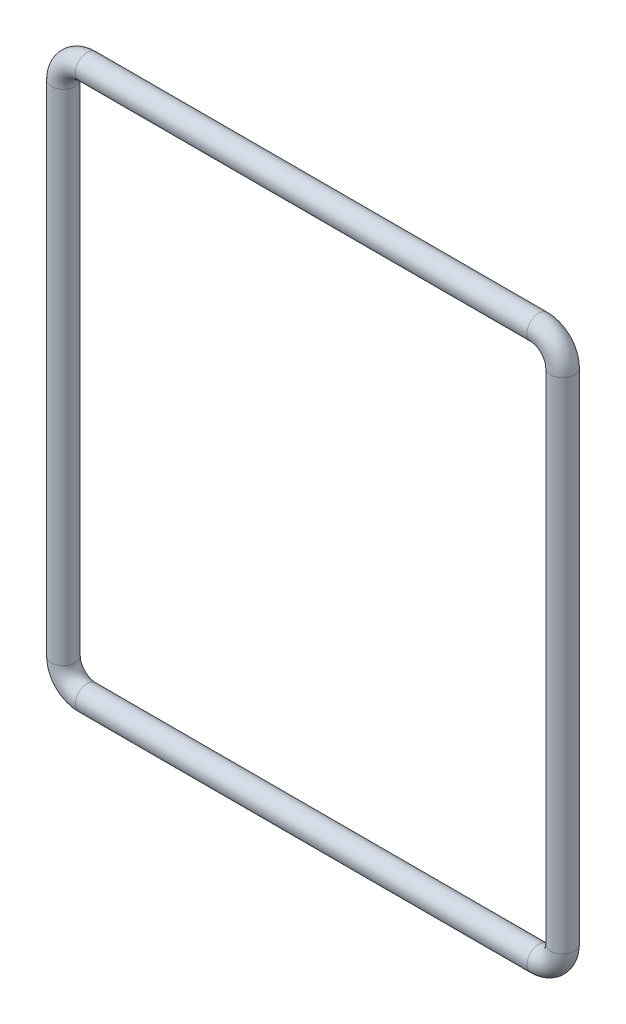
ISO-10303-21;
HEADER;
FILE_DESCRIPTION(('STEP AP214'),'2;1');
FILE_NAME('part.step','',(''),(''),'','','');
FILE_SCHEMA(('AUTOMOTIVE_DESIGN { 1 0 10303 214 1 1 1 1 }'));
ENDSEC;
DATA;
#1=APPLICATION_CONTEXT('core data for automotive mechanical design processes');
#2=APPLICATION_PROTOCOL_DEFINITION('international standard','automotive_design',2000,#1);
#3=PRODUCT_CONTEXT('',#1,'mechanical');
#4=PRODUCT('Part','Part','',(#3));
#5=PRODUCT_RELATED_PRODUCT_CATEGORY('part','',(#4));
#6=PRODUCT_DEFINITION_FORMATION('','',#4);
#7=PRODUCT_DEFINITION_CONTEXT('part definition',#1,'design');
#8=PRODUCT_DEFINITION('design','',#6,#7);
#9=PRODUCT_DEFINITION_SHAPE('','',#8);
#10=(LENGTH_UNIT() NAMED_UNIT(*) SI_UNIT(.MILLI.,.METRE.));
#11=(NAMED_UNIT(*) PLANE_ANGLE_UNIT() SI_UNIT($,.RADIAN.));
#12=(NAMED_UNIT(*) SI_UNIT($,.STERADIAN.) SOLID_ANGLE_UNIT());
#13=UNCERTAINTY_MEASURE_WITH_UNIT(LENGTH_MEASURE(1.E-05),#10,'distance_accuracy_value','');
#14=(GEOMETRIC_REPRESENTATION_CONTEXT(3) GLOBAL_UNCERTAINTY_ASSIGNED_CONTEXT((#13)) GLOBAL_UNIT_ASSIGNED_CONTEXT((#10,
#11,#12)) REPRESENTATION_CONTEXT('',''));
#15=CARTESIAN_POINT('',(0.,0.,0.));
#16=DIRECTION('',(0.,0.,1.));
#17=DIRECTION('',(1.,0.,0.));
#18=AXIS2_PLACEMENT_3D('',#15,#16,#17);
#19=CARTESIAN_POINT('',(19.,21.,0.));
#20=DIRECTION('',(0.,0.,-1.));
#21=DIRECTION('',(-1.,0.,0.));
#22=AXIS2_PLACEMENT_3D('',#19,#20,#21);
#23=TOROIDAL_SURFACE('',#22,2.,0.999999999999998);
#24=CARTESIAN_POINT('',(19.,23.,0.));
#25=DIRECTION('',(-1.,0.,0.));
#26=DIRECTION('',(0.,0.,1.));
#27=AXIS2_PLACEMENT_3D('',#24,#25,#26);
#28=CIRCLE('',#27,0.999999999999998);
#29=CARTESIAN_POINT('',(19.,24.,0.));
#30=VERTEX_POINT('',#29);
#31=EDGE_CURVE('E40',#30,#30,#28,.T.);
#32=CARTESIAN_POINT('',(21.,21.,0.));
#33=DIRECTION('',(0.,1.,0.));
#34=DIRECTION('',(0.,0.,1.));
#35=AXIS2_PLACEMENT_3D('',#32,#33,#34);
#36=CIRCLE('',#35,0.999999999999998);
#37=CARTESIAN_POINT('',(22.,21.,0.));
#38=VERTEX_POINT('',#37);
#39=EDGE_CURVE('E10',#38,#38,#36,.T.);
#40=CARTESIAN_POINT('',(19.,21.,0.));
#41=DIRECTION('',(0.,0.,-1.));
#42=DIRECTION('',(-1.,0.,0.));
#43=AXIS2_PLACEMENT_3D('',#40,#41,#42);
#44=CIRCLE('',#43,3.);
#45=EDGE_CURVE('',#30,#38,#44,.T.);
#46=ORIENTED_EDGE('',*,*,#31,.F.);
#47=ORIENTED_EDGE('',*,*,#39,.T.);
#48=ORIENTED_EDGE('',*,*,#45,.T.);
#49=ORIENTED_EDGE('',*,*,#45,.F.);
#50=EDGE_LOOP('',(#46,#48,#47,#49));
#51=FACE_BOUND('',#50,.T.);
#52=ADVANCED_FACE('F34',(#51),#23,.T.);
#53=CARTESIAN_POINT('',(-19.,23.,0.));
#54=DIRECTION('',(1.,0.,0.));
#55=DIRECTION('',(0.,0.,-1.));
#56=AXIS2_PLACEMENT_3D('',#53,#54,#55);
#57=CYLINDRICAL_SURFACE('',#56,0.999999999999998);
#58=CARTESIAN_POINT('',(-19.,23.,0.));
#59=DIRECTION('',(-1.,0.,0.));
#60=DIRECTION('',(0.,0.,1.));
#61=AXIS2_PLACEMENT_3D('',#58,#59,#60);
#62=CIRCLE('',#61,0.999999999999998);
#63=CARTESIAN_POINT('',(-19.,24.,0.));
#64=VERTEX_POINT('',#63);
#65=EDGE_CURVE('E44',#64,#64,#62,.T.);
#66=ORIENTED_EDGE('',*,*,#65,.F.);
#67=EDGE_LOOP('',(#66));
#68=FACE_BOUND('',#67,.T.);
#69=ORIENTED_EDGE('',*,*,#31,.T.);
#70=EDGE_LOOP('',(#69));
#71=FACE_BOUND('',#70,.T.);
#72=ADVANCED_FACE('F96',(#68,#71),#57,.T.);
#73=CARTESIAN_POINT('',(-19.,21.,0.));
#74=DIRECTION('',(0.,0.,-1.));
#75=DIRECTION('',(-1.,0.,0.));
#76=AXIS2_PLACEMENT_3D('',#73,#74,#75);
#77=TOROIDAL_SURFACE('',#76,2.,0.999999999999998);
#78=CARTESIAN_POINT('',(-21.,21.,0.));
#79=DIRECTION('',(0.,-1.,0.));
#80=DIRECTION('',(0.,0.,1.));
#81=AXIS2_PLACEMENT_3D('',#78,#79,#80);
#82=CIRCLE('',#81,0.999999999999998);
#83=CARTESIAN_POINT('',(-22.,21.,0.));
#84=VERTEX_POINT('',#83);
#85=EDGE_CURVE('E48',#84,#84,#82,.T.);
#86=CARTESIAN_POINT('',(-19.,21.,0.));
#87=DIRECTION('',(0.,0.,-1.));
#88=DIRECTION('',(-1.,0.,0.));
#89=AXIS2_PLACEMENT_3D('',#86,#87,#88);
#90=CIRCLE('',#89,3.);
#91=EDGE_CURVE('',#84,#64,#90,.T.);
#92=ORIENTED_EDGE('',*,*,#85,.F.);
#93=ORIENTED_EDGE('',*,*,#65,.T.);
#94=ORIENTED_EDGE('',*,*,#91,.T.);
#95=ORIENTED_EDGE('',*,*,#91,.F.);
#96=EDGE_LOOP('',(#92,#94,#93,#95));
#97=FACE_BOUND('',#96,.T.);
#98=ADVANCED_FACE('F90',(#97),#77,.T.);
#99=CARTESIAN_POINT('',(-21.,-21.,0.));
#100=DIRECTION('',(0.,1.,0.));
#101=DIRECTION('',(-1.,0.,0.));
#102=AXIS2_PLACEMENT_3D('',#99,#100,#101);
#103=CYLINDRICAL_SURFACE('',#102,0.999999999999998);
#104=CARTESIAN_POINT('',(-21.,-21.,0.));
#105=DIRECTION('',(0.,-1.,0.));
#106=DIRECTION('',(0.,0.,1.));
#107=AXIS2_PLACEMENT_3D('',#104,#105,#106);
#108=CIRCLE('',#107,0.999999999999998);
#109=CARTESIAN_POINT('',(-22.,-21.,0.));
#110=VERTEX_POINT('',#109);
#111=EDGE_CURVE('E53',#110,#110,#108,.T.);
#112=ORIENTED_EDGE('',*,*,#111,.F.);
#113=EDGE_LOOP('',(#112));
#114=FACE_BOUND('',#113,.T.);
#115=ORIENTED_EDGE('',*,*,#85,.T.);
#116=EDGE_LOOP('',(#115));
#117=FACE_BOUND('',#116,.T.);
#118=ADVANCED_FACE('F84',(#114,#117),#103,.T.);
#119=CARTESIAN_POINT('',(-19.,-21.,0.));
#120=DIRECTION('',(0.,0.,-1.));
#121=DIRECTION('',(-1.,0.,0.));
#122=AXIS2_PLACEMENT_3D('',#119,#120,#121);
#123=TOROIDAL_SURFACE('',#122,2.,0.999999999999998);
#124=CARTESIAN_POINT('',(-19.,-23.,0.));
#125=DIRECTION('',(1.,0.,0.));
#126=DIRECTION('',(0.,0.,1.));
#127=AXIS2_PLACEMENT_3D('',#124,#125,#126);
#128=CIRCLE('',#127,0.999999999999998);
#129=CARTESIAN_POINT('',(-19.,-24.,0.));
#130=VERTEX_POINT('',#129);
#131=EDGE_CURVE('E56',#130,#130,#128,.T.);
#132=CARTESIAN_POINT('',(-19.,-21.,0.));
#133=DIRECTION('',(0.,0.,-1.));
#134=DIRECTION('',(-1.,0.,0.));
#135=AXIS2_PLACEMENT_3D('',#132,#133,#134);
#136=CIRCLE('',#135,3.);
#137=EDGE_CURVE('',#130,#110,#136,.T.);
#138=ORIENTED_EDGE('',*,*,#131,.F.);
#139=ORIENTED_EDGE('',*,*,#111,.T.);
#140=ORIENTED_EDGE('',*,*,#137,.T.);
#141=ORIENTED_EDGE('',*,*,#137,.F.);
#142=EDGE_LOOP('',(#138,#140,#139,#141));
#143=FACE_BOUND('',#142,.T.);
#144=ADVANCED_FACE('F78',(#143),#123,.T.);
#145=CARTESIAN_POINT('',(19.,-23.,0.));
#146=DIRECTION('',(-1.,0.,0.));
#147=DIRECTION('',(0.,-1.,0.));
#148=AXIS2_PLACEMENT_3D('',#145,#146,#147);
#149=CYLINDRICAL_SURFACE('',#148,0.999999999999998);
#150=CARTESIAN_POINT('',(19.,-23.,0.));
#151=DIRECTION('',(1.,0.,0.));
#152=DIRECTION('',(0.,0.,1.));
#153=AXIS2_PLACEMENT_3D('',#150,#151,#152);
#154=CIRCLE('',#153,0.999999999999998);
#155=CARTESIAN_POINT('',(19.,-24.,0.));
#156=VERTEX_POINT('',#155);
#157=EDGE_CURVE('E59',#156,#156,#154,.T.);
#158=ORIENTED_EDGE('',*,*,#157,.F.);
#159=EDGE_LOOP('',(#158));
#160=FACE_BOUND('',#159,.T.);
#161=ORIENTED_EDGE('',*,*,#131,.T.);
#162=EDGE_LOOP('',(#161));
#163=FACE_BOUND('',#162,.T.);
#164=ADVANCED_FACE('F72',(#160,#163),#149,.T.);
#165=CARTESIAN_POINT('',(19.,-21.,0.));
#166=DIRECTION('',(0.,0.,-1.));
#167=DIRECTION('',(-1.,0.,0.));
#168=AXIS2_PLACEMENT_3D('',#165,#166,#167);
#169=TOROIDAL_SURFACE('',#168,1.99999999999999,0.999999999999998);
#170=CARTESIAN_POINT('',(21.,-21.,0.));
#171=DIRECTION('',(0.,1.,0.));
#172=DIRECTION('',(0.,0.,1.));
#173=AXIS2_PLACEMENT_3D('',#170,#171,#172);
#174=CIRCLE('',#173,0.999999999999998);
#175=CARTESIAN_POINT('',(22.,-21.,0.));
#176=VERTEX_POINT('',#175);
#177=EDGE_CURVE('E62',#176,#176,#174,.T.);
#178=CARTESIAN_POINT('',(19.,-21.,0.));
#179=DIRECTION('',(0.,0.,-1.));
#180=DIRECTION('',(-1.,0.,0.));
#181=AXIS2_PLACEMENT_3D('',#178,#179,#180);
#182=CIRCLE('',#181,2.99999999999999);
#183=EDGE_CURVE('',#176,#156,#182,.T.);
#184=ORIENTED_EDGE('',*,*,#177,.F.);
#185=ORIENTED_EDGE('',*,*,#157,.T.);
#186=ORIENTED_EDGE('',*,*,#183,.T.);
#187=ORIENTED_EDGE('',*,*,#183,.F.);
#188=EDGE_LOOP('',(#184,#186,#185,#187));
#189=FACE_BOUND('',#188,.T.);
#190=ADVANCED_FACE('F69',(#189),#169,.T.);
#191=CARTESIAN_POINT('',(21.,-21.,0.));
#192=DIRECTION('',(0.,1.,0.));
#193=DIRECTION('',(-1.,0.,0.));
#194=AXIS2_PLACEMENT_3D('',#191,#192,#193);
#195=CYLINDRICAL_SURFACE('',#194,0.999999999999998);
#196=ORIENTED_EDGE('',*,*,#177,.T.);
#197=EDGE_LOOP('',(#196));
#198=FACE_BOUND('',#197,.T.);
#199=ORIENTED_EDGE('',*,*,#39,.F.);
#200=EDGE_LOOP('',(#199));
#201=FACE_BOUND('',#200,.T.);
#202=ADVANCED_FACE('F66',(#198,#201),#195,.T.);
#203=CLOSED_SHELL('',(#52,#72,#98,#118,#144,#164,#190,#202));
#204=MANIFOLD_SOLID_BREP('B2',#203);
#205=ADVANCED_BREP_SHAPE_REPRESENTATION('',(#18,#204),#14);
#206=SHAPE_DEFINITION_REPRESENTATION(#9,#205);
ENDSEC;
END-ISO-10303-21;
